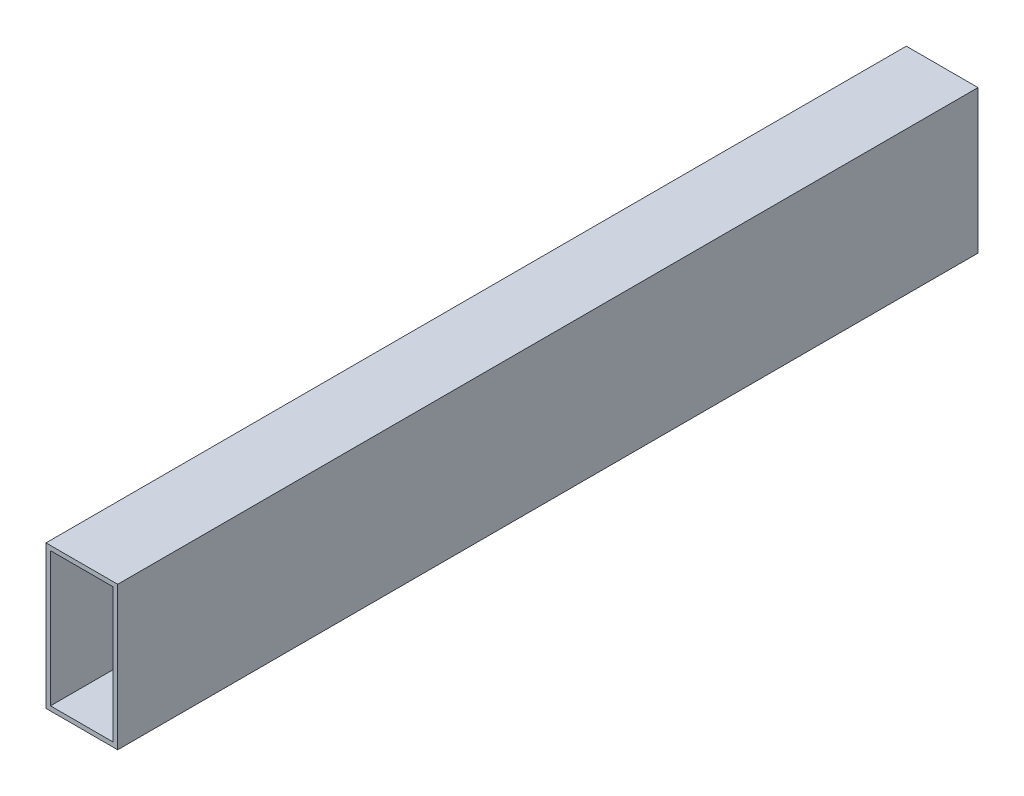
ISO-10303-21;
HEADER;
FILE_DESCRIPTION(('STEP AP214'),'2;1');
FILE_NAME('part.step','',(''),(''),'','','');
FILE_SCHEMA(('AUTOMOTIVE_DESIGN { 1 0 10303 214 1 1 1 1 }'));
ENDSEC;
DATA;
#1=APPLICATION_CONTEXT('core data for automotive mechanical design processes');
#2=APPLICATION_PROTOCOL_DEFINITION('international standard','automotive_design',2000,#1);
#3=PRODUCT_CONTEXT('',#1,'mechanical');
#4=PRODUCT('Part','Part','',(#3));
#5=PRODUCT_RELATED_PRODUCT_CATEGORY('part','',(#4));
#6=PRODUCT_DEFINITION_FORMATION('','',#4);
#7=PRODUCT_DEFINITION_CONTEXT('part definition',#1,'design');
#8=PRODUCT_DEFINITION('design','',#6,#7);
#9=PRODUCT_DEFINITION_SHAPE('','',#8);
#10=(LENGTH_UNIT() NAMED_UNIT(*) SI_UNIT(.MILLI.,.METRE.));
#11=(NAMED_UNIT(*) PLANE_ANGLE_UNIT() SI_UNIT($,.RADIAN.));
#12=(NAMED_UNIT(*) SI_UNIT($,.STERADIAN.) SOLID_ANGLE_UNIT());
#13=UNCERTAINTY_MEASURE_WITH_UNIT(LENGTH_MEASURE(1.E-05),#10,'distance_accuracy_value','');
#14=(GEOMETRIC_REPRESENTATION_CONTEXT(3) GLOBAL_UNCERTAINTY_ASSIGNED_CONTEXT((#13)) GLOBAL_UNIT_ASSIGNED_CONTEXT((#10,
#11,#12)) REPRESENTATION_CONTEXT('',''));
#15=CARTESIAN_POINT('',(0.,0.,0.));
#16=DIRECTION('',(0.,0.,1.));
#17=DIRECTION('',(1.,0.,0.));
#18=AXIS2_PLACEMENT_3D('',#15,#16,#17);
#19=CARTESIAN_POINT('',(0.,0.,304.8));
#20=DIRECTION('',(0.,0.,1.));
#21=DIRECTION('',(1.,0.,0.));
#22=AXIS2_PLACEMENT_3D('',#19,#20,#21);
#23=PLANE('',#22);
#24=DIRECTION('',(0.,-1.,0.));
#25=VECTOR('',#24,1.);
#26=CARTESIAN_POINT('',(0.,0.,304.8));
#27=LINE('',#26,#25);
#28=CARTESIAN_POINT('',(0.,50.8,304.8));
#29=VERTEX_POINT('',#28);
#30=CARTESIAN_POINT('',(0.,0.,304.8));
#31=VERTEX_POINT('',#30);
#32=EDGE_CURVE('E181',#29,#31,#27,.T.);
#33=ORIENTED_EDGE('',*,*,#32,.T.);
#34=DIRECTION('',(1.,0.,0.));
#35=VECTOR('',#34,1.);
#36=CARTESIAN_POINT('',(0.,0.,304.8));
#37=LINE('',#36,#35);
#38=CARTESIAN_POINT('',(25.4,0.,304.8));
#39=VERTEX_POINT('',#38);
#40=EDGE_CURVE('E184',#31,#39,#37,.T.);
#41=ORIENTED_EDGE('',*,*,#40,.T.);
#42=DIRECTION('',(0.,1.,0.));
#43=VECTOR('',#42,1.);
#44=CARTESIAN_POINT('',(25.4,0.,304.8));
#45=LINE('',#44,#43);
#46=CARTESIAN_POINT('',(25.4,50.8,304.8));
#47=VERTEX_POINT('',#46);
#48=EDGE_CURVE('E187',#39,#47,#45,.T.);
#49=ORIENTED_EDGE('',*,*,#48,.T.);
#50=DIRECTION('',(-1.,0.,0.));
#51=VECTOR('',#50,1.);
#52=CARTESIAN_POINT('',(0.,50.8,304.8));
#53=LINE('',#52,#51);
#54=EDGE_CURVE('E189',#47,#29,#53,.T.);
#55=ORIENTED_EDGE('',*,*,#54,.T.);
#56=EDGE_LOOP('',(#33,#41,#49,#55));
#57=FACE_BOUND('',#56,.T.);
#58=DIRECTION('',(1.,0.,0.));
#59=VECTOR('',#58,1.);
#60=CARTESIAN_POINT('',(0.,1.5875,304.8));
#61=LINE('',#60,#59);
#62=CARTESIAN_POINT('',(1.5875,1.5875,304.8));
#63=VERTEX_POINT('',#62);
#64=CARTESIAN_POINT('',(23.8125,1.5875,304.8));
#65=VERTEX_POINT('',#64);
#66=EDGE_CURVE('E145',#63,#65,#61,.T.);
#67=ORIENTED_EDGE('',*,*,#66,.F.);
#68=DIRECTION('',(0.,-1.,0.));
#69=VECTOR('',#68,1.);
#70=CARTESIAN_POINT('',(1.5875,0.,304.8));
#71=LINE('',#70,#69);
#72=CARTESIAN_POINT('',(1.5875,49.2125,304.8));
#73=VERTEX_POINT('',#72);
#74=EDGE_CURVE('E137',#73,#63,#71,.T.);
#75=ORIENTED_EDGE('',*,*,#74,.F.);
#76=DIRECTION('',(-1.,0.,0.));
#77=VECTOR('',#76,1.);
#78=CARTESIAN_POINT('',(0.,49.2125,304.8));
#79=LINE('',#78,#77);
#80=CARTESIAN_POINT('',(23.8125,49.2125,304.8));
#81=VERTEX_POINT('',#80);
#82=EDGE_CURVE('E160',#81,#73,#79,.T.);
#83=ORIENTED_EDGE('',*,*,#82,.F.);
#84=DIRECTION('',(0.,1.,0.));
#85=VECTOR('',#84,1.);
#86=CARTESIAN_POINT('',(23.8125,0.,304.8));
#87=LINE('',#86,#85);
#88=EDGE_CURVE('E158',#65,#81,#87,.T.);
#89=ORIENTED_EDGE('',*,*,#88,.F.);
#90=EDGE_LOOP('',(#67,#75,#83,#89));
#91=FACE_BOUND('',#90,.T.);
#92=ADVANCED_FACE('F63',(#57,#91),#23,.T.);
#93=CARTESIAN_POINT('',(0.,0.,0.));
#94=DIRECTION('',(0.,0.,1.));
#95=DIRECTION('',(1.,0.,0.));
#96=AXIS2_PLACEMENT_3D('',#93,#94,#95);
#97=PLANE('',#96);
#98=DIRECTION('',(0.,-1.,0.));
#99=VECTOR('',#98,1.);
#100=CARTESIAN_POINT('',(0.,0.,0.));
#101=LINE('',#100,#99);
#102=CARTESIAN_POINT('',(0.,50.8,0.));
#103=VERTEX_POINT('',#102);
#104=CARTESIAN_POINT('',(0.,0.,0.));
#105=VERTEX_POINT('',#104);
#106=EDGE_CURVE('E154',#103,#105,#101,.T.);
#107=ORIENTED_EDGE('',*,*,#106,.F.);
#108=DIRECTION('',(-1.,0.,0.));
#109=VECTOR('',#108,1.);
#110=CARTESIAN_POINT('',(0.,50.8,0.));
#111=LINE('',#110,#109);
#112=CARTESIAN_POINT('',(25.4,50.8,0.));
#113=VERTEX_POINT('',#112);
#114=EDGE_CURVE('E185',#113,#103,#111,.T.);
#115=ORIENTED_EDGE('',*,*,#114,.F.);
#116=DIRECTION('',(0.,1.,0.));
#117=VECTOR('',#116,1.);
#118=CARTESIAN_POINT('',(25.4,0.,0.));
#119=LINE('',#118,#117);
#120=CARTESIAN_POINT('',(25.4,0.,0.));
#121=VERTEX_POINT('',#120);
#122=EDGE_CURVE('E198',#121,#113,#119,.T.);
#123=ORIENTED_EDGE('',*,*,#122,.F.);
#124=DIRECTION('',(1.,0.,0.));
#125=VECTOR('',#124,1.);
#126=CARTESIAN_POINT('',(0.,0.,0.));
#127=LINE('',#126,#125);
#128=EDGE_CURVE('E195',#105,#121,#127,.T.);
#129=ORIENTED_EDGE('',*,*,#128,.F.);
#130=EDGE_LOOP('',(#107,#115,#123,#129));
#131=FACE_BOUND('',#130,.T.);
#132=DIRECTION('',(0.,-1.,0.));
#133=VECTOR('',#132,1.);
#134=CARTESIAN_POINT('',(1.5875,0.,0.));
#135=LINE('',#134,#133);
#136=CARTESIAN_POINT('',(1.5875,49.2125,0.));
#137=VERTEX_POINT('',#136);
#138=CARTESIAN_POINT('',(1.5875,1.5875,0.));
#139=VERTEX_POINT('',#138);
#140=EDGE_CURVE('E90',#137,#139,#135,.T.);
#141=ORIENTED_EDGE('',*,*,#140,.T.);
#142=DIRECTION('',(1.,0.,0.));
#143=VECTOR('',#142,1.);
#144=CARTESIAN_POINT('',(0.,1.5875,0.));
#145=LINE('',#144,#143);
#146=CARTESIAN_POINT('',(23.8125,1.5875,0.));
#147=VERTEX_POINT('',#146);
#148=EDGE_CURVE('E152',#139,#147,#145,.T.);
#149=ORIENTED_EDGE('',*,*,#148,.T.);
#150=DIRECTION('',(0.,1.,0.));
#151=VECTOR('',#150,1.);
#152=CARTESIAN_POINT('',(23.8125,0.,0.));
#153=LINE('',#152,#151);
#154=CARTESIAN_POINT('',(23.8125,49.2125,0.));
#155=VERTEX_POINT('',#154);
#156=EDGE_CURVE('E168',#147,#155,#153,.T.);
#157=ORIENTED_EDGE('',*,*,#156,.T.);
#158=DIRECTION('',(-1.,0.,0.));
#159=VECTOR('',#158,1.);
#160=CARTESIAN_POINT('',(0.,49.2125,0.));
#161=LINE('',#160,#159);
#162=EDGE_CURVE('E146',#155,#137,#161,.T.);
#163=ORIENTED_EDGE('',*,*,#162,.T.);
#164=EDGE_LOOP('',(#141,#149,#157,#163));
#165=FACE_BOUND('',#164,.T.);
#166=ADVANCED_FACE('F221',(#131,#165),#97,.F.);
#167=CARTESIAN_POINT('',(0.,0.,304.8));
#168=DIRECTION('',(1.,0.,0.));
#169=DIRECTION('',(0.,0.,-1.));
#170=AXIS2_PLACEMENT_3D('',#167,#168,#169);
#171=PLANE('',#170);
#172=ORIENTED_EDGE('',*,*,#106,.T.);
#173=DIRECTION('',(0.,0.,-1.));
#174=VECTOR('',#173,1.);
#175=CARTESIAN_POINT('',(0.,0.,304.8));
#176=LINE('',#175,#174);
#177=EDGE_CURVE('E12',#31,#105,#176,.T.);
#178=ORIENTED_EDGE('',*,*,#177,.F.);
#179=ORIENTED_EDGE('',*,*,#32,.F.);
#180=DIRECTION('',(0.,0.,-1.));
#181=VECTOR('',#180,1.);
#182=CARTESIAN_POINT('',(0.,50.8,304.8));
#183=LINE('',#182,#181);
#184=EDGE_CURVE('E191',#29,#103,#183,.T.);
#185=ORIENTED_EDGE('',*,*,#184,.T.);
#186=EDGE_LOOP('',(#172,#178,#179,#185));
#187=FACE_BOUND('',#186,.T.);
#188=ADVANCED_FACE('F65',(#187),#171,.F.);
#189=CARTESIAN_POINT('',(0.,0.,304.8));
#190=DIRECTION('',(0.,1.,0.));
#191=DIRECTION('',(0.,0.,1.));
#192=AXIS2_PLACEMENT_3D('',#189,#190,#191);
#193=PLANE('',#192);
#194=ORIENTED_EDGE('',*,*,#128,.T.);
#195=DIRECTION('',(0.,0.,-1.));
#196=VECTOR('',#195,1.);
#197=CARTESIAN_POINT('',(25.4,0.,304.8));
#198=LINE('',#197,#196);
#199=EDGE_CURVE('E72',#39,#121,#198,.T.);
#200=ORIENTED_EDGE('',*,*,#199,.F.);
#201=ORIENTED_EDGE('',*,*,#40,.F.);
#202=ORIENTED_EDGE('',*,*,#177,.T.);
#203=EDGE_LOOP('',(#194,#200,#201,#202));
#204=FACE_BOUND('',#203,.T.);
#205=ADVANCED_FACE('F231',(#204),#193,.F.);
#206=CARTESIAN_POINT('',(25.4,0.,304.8));
#207=DIRECTION('',(-1.,0.,0.));
#208=DIRECTION('',(0.,0.,1.));
#209=AXIS2_PLACEMENT_3D('',#206,#207,#208);
#210=PLANE('',#209);
#211=ORIENTED_EDGE('',*,*,#122,.T.);
#212=DIRECTION('',(0.,0.,-1.));
#213=VECTOR('',#212,1.);
#214=CARTESIAN_POINT('',(25.4,50.8,304.8));
#215=LINE('',#214,#213);
#216=EDGE_CURVE('E206',#47,#113,#215,.T.);
#217=ORIENTED_EDGE('',*,*,#216,.F.);
#218=ORIENTED_EDGE('',*,*,#48,.F.);
#219=ORIENTED_EDGE('',*,*,#199,.T.);
#220=EDGE_LOOP('',(#211,#217,#218,#219));
#221=FACE_BOUND('',#220,.T.);
#222=ADVANCED_FACE('F215',(#221),#210,.F.);
#223=CARTESIAN_POINT('',(0.,50.8,304.8));
#224=DIRECTION('',(0.,-1.,0.));
#225=DIRECTION('',(0.,0.,-1.));
#226=AXIS2_PLACEMENT_3D('',#223,#224,#225);
#227=PLANE('',#226);
#228=ORIENTED_EDGE('',*,*,#114,.T.);
#229=ORIENTED_EDGE('',*,*,#184,.F.);
#230=ORIENTED_EDGE('',*,*,#54,.F.);
#231=ORIENTED_EDGE('',*,*,#216,.T.);
#232=EDGE_LOOP('',(#228,#229,#230,#231));
#233=FACE_BOUND('',#232,.T.);
#234=ADVANCED_FACE('F225',(#233),#227,.F.);
#235=CARTESIAN_POINT('',(1.5875,0.,304.8));
#236=DIRECTION('',(1.,0.,0.));
#237=DIRECTION('',(0.,0.,-1.));
#238=AXIS2_PLACEMENT_3D('',#235,#236,#237);
#239=PLANE('',#238);
#240=ORIENTED_EDGE('',*,*,#140,.F.);
#241=DIRECTION('',(0.,0.,-1.));
#242=VECTOR('',#241,1.);
#243=CARTESIAN_POINT('',(1.5875,49.2125,304.8));
#244=LINE('',#243,#242);
#245=EDGE_CURVE('E141',#73,#137,#244,.T.);
#246=ORIENTED_EDGE('',*,*,#245,.F.);
#247=ORIENTED_EDGE('',*,*,#74,.T.);
#248=DIRECTION('',(0.,0.,-1.));
#249=VECTOR('',#248,1.);
#250=CARTESIAN_POINT('',(1.5875,1.5875,304.8));
#251=LINE('',#250,#249);
#252=EDGE_CURVE('E140',#63,#139,#251,.T.);
#253=ORIENTED_EDGE('',*,*,#252,.T.);
#254=EDGE_LOOP('',(#240,#246,#247,#253));
#255=FACE_BOUND('',#254,.T.);
#256=ADVANCED_FACE('F139',(#255),#239,.T.);
#257=CARTESIAN_POINT('',(0.,1.5875,304.8));
#258=DIRECTION('',(0.,1.,0.));
#259=DIRECTION('',(0.,0.,1.));
#260=AXIS2_PLACEMENT_3D('',#257,#258,#259);
#261=PLANE('',#260);
#262=ORIENTED_EDGE('',*,*,#148,.F.);
#263=ORIENTED_EDGE('',*,*,#252,.F.);
#264=ORIENTED_EDGE('',*,*,#66,.T.);
#265=DIRECTION('',(0.,0.,-1.));
#266=VECTOR('',#265,1.);
#267=CARTESIAN_POINT('',(23.8125,1.5875,304.8));
#268=LINE('',#267,#266);
#269=EDGE_CURVE('E155',#65,#147,#268,.T.);
#270=ORIENTED_EDGE('',*,*,#269,.T.);
#271=EDGE_LOOP('',(#262,#263,#264,#270));
#272=FACE_BOUND('',#271,.T.);
#273=ADVANCED_FACE('F149',(#272),#261,.T.);
#274=CARTESIAN_POINT('',(23.8125,0.,304.8));
#275=DIRECTION('',(-1.,0.,0.));
#276=DIRECTION('',(0.,0.,1.));
#277=AXIS2_PLACEMENT_3D('',#274,#275,#276);
#278=PLANE('',#277);
#279=ORIENTED_EDGE('',*,*,#156,.F.);
#280=ORIENTED_EDGE('',*,*,#269,.F.);
#281=ORIENTED_EDGE('',*,*,#88,.T.);
#282=DIRECTION('',(0.,0.,-1.));
#283=VECTOR('',#282,1.);
#284=CARTESIAN_POINT('',(23.8125,49.2125,304.8));
#285=LINE('',#284,#283);
#286=EDGE_CURVE('E79',#81,#155,#285,.T.);
#287=ORIENTED_EDGE('',*,*,#286,.T.);
#288=EDGE_LOOP('',(#279,#280,#281,#287));
#289=FACE_BOUND('',#288,.T.);
#290=ADVANCED_FACE('F254',(#289),#278,.T.);
#291=CARTESIAN_POINT('',(0.,49.2125,304.8));
#292=DIRECTION('',(0.,-1.,0.));
#293=DIRECTION('',(0.,0.,-1.));
#294=AXIS2_PLACEMENT_3D('',#291,#292,#293);
#295=PLANE('',#294);
#296=ORIENTED_EDGE('',*,*,#162,.F.);
#297=ORIENTED_EDGE('',*,*,#286,.F.);
#298=ORIENTED_EDGE('',*,*,#82,.T.);
#299=ORIENTED_EDGE('',*,*,#245,.T.);
#300=EDGE_LOOP('',(#296,#297,#298,#299));
#301=FACE_BOUND('',#300,.T.);
#302=ADVANCED_FACE('F258',(#301),#295,.T.);
#303=CLOSED_SHELL('',(#92,#166,#188,#205,#222,#234,#256,#273,#290,#302));
#304=MANIFOLD_SOLID_BREP('B2',#303);
#305=ADVANCED_BREP_SHAPE_REPRESENTATION('',(#18,#304),#14);
#306=SHAPE_DEFINITION_REPRESENTATION(#9,#305);
ENDSEC;
END-ISO-10303-21;
